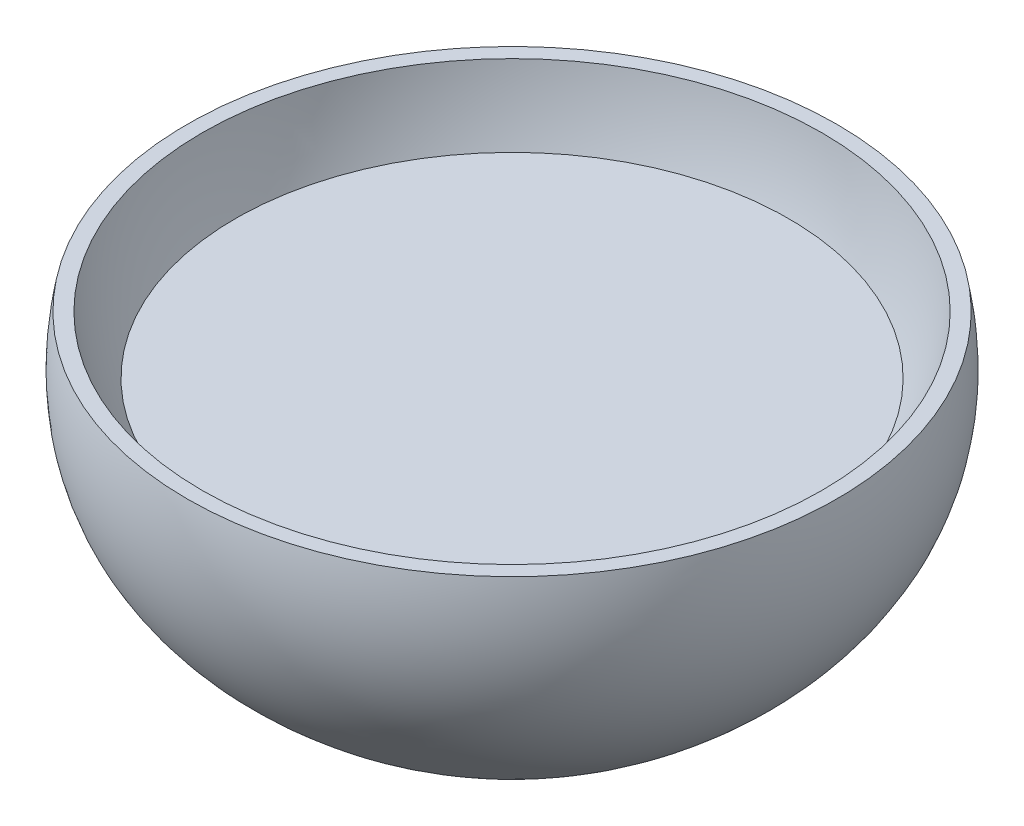
ISO-10303-21;
HEADER;
FILE_DESCRIPTION(('STEP AP214'),'2;1');
FILE_NAME('part.step','',(''),(''),'','','');
FILE_SCHEMA(('AUTOMOTIVE_DESIGN { 1 0 10303 214 1 1 1 1 }'));
ENDSEC;
DATA;
#1=APPLICATION_CONTEXT('core data for automotive mechanical design processes');
#2=APPLICATION_PROTOCOL_DEFINITION('international standard','automotive_design',2000,#1);
#3=PRODUCT_CONTEXT('',#1,'mechanical');
#4=PRODUCT('Part','Part','',(#3));
#5=PRODUCT_RELATED_PRODUCT_CATEGORY('part','',(#4));
#6=PRODUCT_DEFINITION_FORMATION('','',#4);
#7=PRODUCT_DEFINITION_CONTEXT('part definition',#1,'design');
#8=PRODUCT_DEFINITION('design','',#6,#7);
#9=PRODUCT_DEFINITION_SHAPE('','',#8);
#10=(LENGTH_UNIT() NAMED_UNIT(*) SI_UNIT(.MILLI.,.METRE.));
#11=(NAMED_UNIT(*) PLANE_ANGLE_UNIT() SI_UNIT($,.RADIAN.));
#12=(NAMED_UNIT(*) SI_UNIT($,.STERADIAN.) SOLID_ANGLE_UNIT());
#13=UNCERTAINTY_MEASURE_WITH_UNIT(LENGTH_MEASURE(1.E-05),#10,'distance_accuracy_value','');
#14=(GEOMETRIC_REPRESENTATION_CONTEXT(3) GLOBAL_UNCERTAINTY_ASSIGNED_CONTEXT((#13)) GLOBAL_UNIT_ASSIGNED_CONTEXT((#10,
#11,#12)) REPRESENTATION_CONTEXT('',''));
#15=CARTESIAN_POINT('',(0.,0.,0.));
#16=DIRECTION('',(0.,0.,1.));
#17=DIRECTION('',(1.,0.,0.));
#18=AXIS2_PLACEMENT_3D('',#15,#16,#17);
#19=CARTESIAN_POINT('',(-5.17300770042439,62.1125861615575,0.));
#20=DIRECTION('',(0.,1.,0.));
#21=DIRECTION('',(0.,0.,1.));
#22=AXIS2_PLACEMENT_3D('',#19,#20,#21);
#23=CONICAL_SURFACE('',#22,55.9585778027483,0.5235987755983);
#24=CARTESIAN_POINT('',(-5.17300770042439,21.2185861615574,0.));
#25=DIRECTION('',(0.,1.,0.));
#26=DIRECTION('',(0.,0.,1.));
#27=AXIS2_PLACEMENT_3D('',#24,#25,#26);
#28=CIRCLE('',#27,32.3484158945076);
#29=CARTESIAN_POINT('',(-5.17300770042439,21.2185861615574,32.3484158945076));
#30=VERTEX_POINT('',#29);
#31=EDGE_CURVE('E11',#30,#30,#28,.T.);
#32=ORIENTED_EDGE('',*,*,#31,.T.);
#33=EDGE_LOOP('',(#32));
#34=FACE_BOUND('',#33,.T.);
#35=CARTESIAN_POINT('',(-5.17300770042439,51.6985861615574,0.));
#36=DIRECTION('',(0.,1.,0.));
#37=DIRECTION('',(0.,0.,1.));
#38=AXIS2_PLACEMENT_3D('',#35,#36,#37);
#39=CIRCLE('',#38,49.9460520994075);
#40=CARTESIAN_POINT('',(-5.17300770042439,51.6985861615574,49.9460520994075));
#41=VERTEX_POINT('',#40);
#42=EDGE_CURVE('E49',#41,#41,#39,.T.);
#43=ORIENTED_EDGE('',*,*,#42,.F.);
#44=EDGE_LOOP('',(#43));
#45=FACE_BOUND('',#44,.T.);
#46=ADVANCED_FACE('F43',(#34,#45),#23,.T.);
#47=CARTESIAN_POINT('',(-5.17300770042439,21.2185861615574,0.));
#48=DIRECTION('',(0.,1.,0.));
#49=DIRECTION('',(0.,0.,1.));
#50=AXIS2_PLACEMENT_3D('',#47,#48,#49);
#51=PLANE('',#50);
#52=ORIENTED_EDGE('',*,*,#31,.F.);
#53=EDGE_LOOP('',(#52));
#54=FACE_BOUND('',#53,.T.);
#55=ADVANCED_FACE('F58',(#54),#51,.F.);
#56=CARTESIAN_POINT('',(-5.17300770042439,51.6985861615574,0.));
#57=DIRECTION('',(0.,1.,0.));
#58=DIRECTION('',(0.,0.,1.));
#59=AXIS2_PLACEMENT_3D('',#56,#57,#58);
#60=PLANE('',#59);
#61=ORIENTED_EDGE('',*,*,#42,.T.);
#62=EDGE_LOOP('',(#61));
#63=FACE_BOUND('',#62,.T.);
#64=ADVANCED_FACE('F55',(#63),#60,.T.);
#65=CLOSED_SHELL('',(#46,#55,#64));
#66=MANIFOLD_SOLID_BREP('B2',#65);
#67=CARTESIAN_POINT('',(-5.17300770042439,73.3169800154624,0.));
#68=DIRECTION('',(0.,1.,0.));
#69=DIRECTION('',(0.,0.,1.));
#70=AXIS2_PLACEMENT_3D('',#67,#68,#69);
#71=DEGENERATE_TOROIDAL_SURFACE('',#70,14.1921457973222,71.0398653098871,.F.);
#72=CARTESIAN_POINT('',(-5.17300770042439,62.1125861615575,0.));
#73=DIRECTION('',(0.,1.,0.));
#74=DIRECTION('',(0.,0.,1.));
#75=AXIS2_PLACEMENT_3D('',#72,#73,#74);
#76=CIRCLE('',#75,55.9585778027483);
#77=CARTESIAN_POINT('',(-5.17300770042439,62.1125861615575,55.9585778027483));
#78=VERTEX_POINT('',#77);
#79=EDGE_CURVE('E100',#78,#78,#76,.T.);
#80=ORIENTED_EDGE('',*,*,#79,.T.);
#81=EDGE_LOOP('',(#80));
#82=FACE_BOUND('',#81,.T.);
#83=CARTESIAN_POINT('',(-5.17300770042439,4.96748628467003,0.));
#84=DIRECTION('',(0.,1.,0.));
#85=DIRECTION('',(0.,0.,1.));
#86=AXIS2_PLACEMENT_3D('',#83,#84,#85);
#87=CIRCLE('',#86,5.17300770042439);
#88=CARTESIAN_POINT('',(-5.17300770042439,4.96748628467003,5.17300770042439));
#89=VERTEX_POINT('',#88);
#90=EDGE_CURVE('E42',#89,#89,#87,.T.);
#91=ORIENTED_EDGE('',*,*,#90,.F.);
#92=EDGE_LOOP('',(#91));
#93=FACE_BOUND('',#92,.T.);
#94=ADVANCED_FACE('F86',(#82,#93),#71,.T.);
#95=CARTESIAN_POINT('',(0.,4.96748628467003,0.));
#96=DIRECTION('',(0.,-1.,0.));
#97=DIRECTION('',(0.,0.,-1.));
#98=AXIS2_PLACEMENT_3D('',#95,#96,#97);
#99=PLANE('',#98);
#100=ORIENTED_EDGE('',*,*,#90,.T.);
#101=EDGE_LOOP('',(#100));
#102=FACE_BOUND('',#101,.T.);
#103=ADVANCED_FACE('F120',(#102),#99,.F.);
#104=CARTESIAN_POINT('',(0.,0.,0.));
#105=DIRECTION('',(0.,-1.,0.));
#106=DIRECTION('',(0.,0.,-1.));
#107=AXIS2_PLACEMENT_3D('',#104,#105,#106);
#108=PLANE('',#107);
#109=CARTESIAN_POINT('',(-5.17300770042439,0.,0.));
#110=DIRECTION('',(0.,1.,0.));
#111=DIRECTION('',(0.,0.,1.));
#112=AXIS2_PLACEMENT_3D('',#109,#110,#111);
#113=CIRCLE('',#112,5.17300770042439);
#114=CARTESIAN_POINT('',(-5.17300770042439,0.,5.17300770042439));
#115=VERTEX_POINT('',#114);
#116=EDGE_CURVE('E92',#115,#115,#113,.T.);
#117=ORIENTED_EDGE('',*,*,#116,.F.);
#118=EDGE_LOOP('',(#117));
#119=FACE_BOUND('',#118,.T.);
#120=ADVANCED_FACE('F117',(#119),#108,.T.);
#121=CARTESIAN_POINT('',(0.,0.,0.));
#122=CARTESIAN_POINT('',(61.2556633053208,20.5593976443269,0.));
#123=CARTESIAN_POINT('',(53.4672475105928,62.1125861615575,0.));
#124=B_SPLINE_CURVE_WITH_KNOTS('',2,(#121,#122,#123),.UNSPECIFIED.,.F.,.F.,(3,3),(0.,1.),.UNSPECIFIED.);
#125=CARTESIAN_POINT('',(-5.17300770042439,4.96748628467003,0.));
#126=DIRECTION('',(0.,1.,0.));
#127=AXIS1_PLACEMENT('',#125,#126);
#128=SURFACE_OF_REVOLUTION('',#124,#127);
#129=CARTESIAN_POINT('',(-5.17300770042439,62.1125861615575,0.));
#130=DIRECTION('',(0.,1.,0.));
#131=DIRECTION('',(0.,0.,1.));
#132=AXIS2_PLACEMENT_3D('',#129,#130,#131);
#133=CIRCLE('',#132,58.6402552110172);
#134=CARTESIAN_POINT('',(-5.17300770042439,62.1125861615575,58.6402552110172));
#135=VERTEX_POINT('',#134);
#136=EDGE_CURVE('E96',#135,#135,#133,.T.);
#137=ORIENTED_EDGE('',*,*,#136,.F.);
#138=EDGE_LOOP('',(#137));
#139=FACE_BOUND('',#138,.T.);
#140=ORIENTED_EDGE('',*,*,#116,.T.);
#141=EDGE_LOOP('',(#140));
#142=FACE_BOUND('',#141,.T.);
#143=ADVANCED_FACE('F112',(#139,#142),#128,.T.);
#144=CARTESIAN_POINT('',(0.,62.1125861615575,0.));
#145=DIRECTION('',(0.,-1.,0.));
#146=DIRECTION('',(0.,0.,-1.));
#147=AXIS2_PLACEMENT_3D('',#144,#145,#146);
#148=PLANE('',#147);
#149=ORIENTED_EDGE('',*,*,#79,.F.);
#150=EDGE_LOOP('',(#149));
#151=FACE_BOUND('',#150,.T.);
#152=ORIENTED_EDGE('',*,*,#136,.T.);
#153=EDGE_LOOP('',(#152));
#154=FACE_BOUND('',#153,.T.);
#155=ADVANCED_FACE('F116',(#151,#154),#148,.F.);
#156=CLOSED_SHELL('',(#94,#103,#120,#143,#155));
#157=MANIFOLD_SOLID_BREP('B6',#156);
#158=ADVANCED_BREP_SHAPE_REPRESENTATION('',(#18,#66,#157),#14);
#159=SHAPE_DEFINITION_REPRESENTATION(#9,#158);
ENDSEC;
END-ISO-10303-21;
